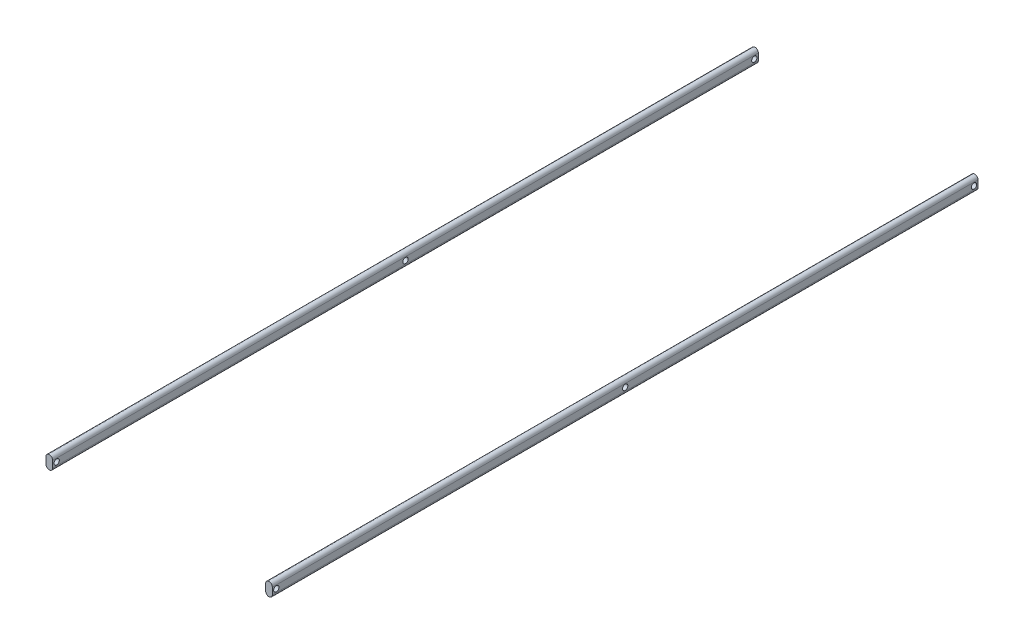
ISO-10303-21;
HEADER;
FILE_DESCRIPTION(('STEP AP214'),'2;1');
FILE_NAME('part.step','',(''),(''),'','','');
FILE_SCHEMA(('AUTOMOTIVE_DESIGN { 1 0 10303 214 1 1 1 1 }'));
ENDSEC;
DATA;
#1=APPLICATION_CONTEXT('core data for automotive mechanical design processes');
#2=APPLICATION_PROTOCOL_DEFINITION('international standard','automotive_design',2000,#1);
#3=PRODUCT_CONTEXT('',#1,'mechanical');
#4=PRODUCT('Part','Part','',(#3));
#5=PRODUCT_RELATED_PRODUCT_CATEGORY('part','',(#4));
#6=PRODUCT_DEFINITION_FORMATION('','',#4);
#7=PRODUCT_DEFINITION_CONTEXT('part definition',#1,'design');
#8=PRODUCT_DEFINITION('design','',#6,#7);
#9=PRODUCT_DEFINITION_SHAPE('','',#8);
#10=(LENGTH_UNIT() NAMED_UNIT(*) SI_UNIT(.MILLI.,.METRE.));
#11=(NAMED_UNIT(*) PLANE_ANGLE_UNIT() SI_UNIT($,.RADIAN.));
#12=(NAMED_UNIT(*) SI_UNIT($,.STERADIAN.) SOLID_ANGLE_UNIT());
#13=UNCERTAINTY_MEASURE_WITH_UNIT(LENGTH_MEASURE(1.E-05),#10,'distance_accuracy_value','');
#14=(GEOMETRIC_REPRESENTATION_CONTEXT(3) GLOBAL_UNCERTAINTY_ASSIGNED_CONTEXT((#13)) GLOBAL_UNIT_ASSIGNED_CONTEXT((#10,
#11,#12)) REPRESENTATION_CONTEXT('',''));
#15=CARTESIAN_POINT('',(0.,0.,0.));
#16=DIRECTION('',(0.,0.,1.));
#17=DIRECTION('',(1.,0.,0.));
#18=AXIS2_PLACEMENT_3D('',#15,#16,#17);
#19=CARTESIAN_POINT('',(92.2540983606557,7.70491803278685,530.));
#20=DIRECTION('',(0.,0.,-1.));
#21=DIRECTION('',(-1.,0.,0.));
#22=AXIS2_PLACEMENT_3D('',#19,#20,#21);
#23=CYLINDRICAL_SURFACE('',#22,2.5);
#24=DIRECTION('',(0.,0.,-1.));
#25=VECTOR('',#24,1.);
#26=CARTESIAN_POINT('',(94.7540983606557,7.70491803278685,100.));
#27=LINE('',#26,#25);
#28=CARTESIAN_POINT('',(94.7540983606557,7.70491803278685,530.));
#29=VERTEX_POINT('',#28);
#30=CARTESIAN_POINT('',(94.7540983606557,7.70491803278685,0.));
#31=VERTEX_POINT('',#30);
#32=EDGE_CURVE('E90',#29,#31,#27,.T.);
#33=ORIENTED_EDGE('',*,*,#32,.F.);
#34=CARTESIAN_POINT('',(92.2540983606557,7.70491803278685,530.));
#35=DIRECTION('',(0.,0.,1.));
#36=DIRECTION('',(1.,0.,0.));
#37=AXIS2_PLACEMENT_3D('',#34,#35,#36);
#38=CIRCLE('',#37,2.5);
#39=CARTESIAN_POINT('',(89.7540983606557,7.70491803278685,530.));
#40=VERTEX_POINT('',#39);
#41=EDGE_CURVE('E53',#40,#29,#38,.T.);
#42=ORIENTED_EDGE('',*,*,#41,.F.);
#43=DIRECTION('',(0.,0.,-1.));
#44=VECTOR('',#43,1.);
#45=CARTESIAN_POINT('',(89.7540983606557,7.70491803278685,100.));
#46=LINE('',#45,#44);
#47=CARTESIAN_POINT('',(89.7540983606557,7.70491803278685,0.));
#48=VERTEX_POINT('',#47);
#49=EDGE_CURVE('E117',#48,#40,#46,.F.);
#50=ORIENTED_EDGE('',*,*,#49,.F.);
#51=CARTESIAN_POINT('',(92.2540983606557,7.70491803278685,0.));
#52=DIRECTION('',(0.,0.,1.));
#53=DIRECTION('',(1.,0.,0.));
#54=AXIS2_PLACEMENT_3D('',#51,#52,#53);
#55=CIRCLE('',#54,2.5);
#56=EDGE_CURVE('E12',#31,#48,#55,.F.);
#57=ORIENTED_EDGE('',*,*,#56,.F.);
#58=EDGE_LOOP('',(#33,#42,#50,#57));
#59=FACE_BOUND('',#58,.T.);
#60=ADVANCED_FACE('F45',(#59),#23,.T.);
#61=CARTESIAN_POINT('',(92.2540983606557,12.7049180327869,0.));
#62=DIRECTION('',(0.,0.,-1.));
#63=DIRECTION('',(-1.,0.,0.));
#64=AXIS2_PLACEMENT_3D('',#61,#62,#63);
#65=CYLINDRICAL_SURFACE('',#64,2.5);
#66=DIRECTION('',(0.,0.,-1.));
#67=VECTOR('',#66,1.);
#68=CARTESIAN_POINT('',(94.7540983606557,12.7049180327869,100.));
#69=LINE('',#68,#67);
#70=CARTESIAN_POINT('',(94.7540983606557,12.7049180327869,0.));
#71=VERTEX_POINT('',#70);
#72=CARTESIAN_POINT('',(94.7540983606557,12.7049180327869,530.));
#73=VERTEX_POINT('',#72);
#74=EDGE_CURVE('E89',#71,#73,#69,.F.);
#75=ORIENTED_EDGE('',*,*,#74,.F.);
#76=CARTESIAN_POINT('',(92.2540983606557,12.7049180327869,0.));
#77=DIRECTION('',(0.,0.,1.));
#78=DIRECTION('',(1.,0.,0.));
#79=AXIS2_PLACEMENT_3D('',#76,#77,#78);
#80=CIRCLE('',#79,2.5);
#81=CARTESIAN_POINT('',(89.7540983606557,12.7049180327869,0.));
#82=VERTEX_POINT('',#81);
#83=EDGE_CURVE('E95',#82,#71,#80,.F.);
#84=ORIENTED_EDGE('',*,*,#83,.F.);
#85=DIRECTION('',(0.,0.,-1.));
#86=VECTOR('',#85,1.);
#87=CARTESIAN_POINT('',(89.7540983606557,12.7049180327869,100.));
#88=LINE('',#87,#86);
#89=CARTESIAN_POINT('',(89.7540983606557,12.7049180327869,530.));
#90=VERTEX_POINT('',#89);
#91=EDGE_CURVE('E103',#90,#82,#88,.T.);
#92=ORIENTED_EDGE('',*,*,#91,.F.);
#93=CARTESIAN_POINT('',(92.2540983606557,12.7049180327869,530.));
#94=DIRECTION('',(0.,0.,1.));
#95=DIRECTION('',(1.,0.,0.));
#96=AXIS2_PLACEMENT_3D('',#93,#94,#95);
#97=CIRCLE('',#96,2.5);
#98=EDGE_CURVE('E102',#73,#90,#97,.T.);
#99=ORIENTED_EDGE('',*,*,#98,.F.);
#100=EDGE_LOOP('',(#75,#84,#92,#99));
#101=FACE_BOUND('',#100,.T.);
#102=ADVANCED_FACE('F106',(#101),#65,.T.);
#103=CARTESIAN_POINT('',(0.,0.,0.));
#104=DIRECTION('',(0.,0.,1.));
#105=DIRECTION('',(1.,0.,0.));
#106=AXIS2_PLACEMENT_3D('',#103,#104,#105);
#107=PLANE('',#106);
#108=DIRECTION('',(0.,1.,0.));
#109=VECTOR('',#108,1.);
#110=CARTESIAN_POINT('',(94.7540983606557,5.20491803278685,0.));
#111=LINE('',#110,#109);
#112=EDGE_CURVE('E83',#31,#71,#111,.T.);
#113=ORIENTED_EDGE('',*,*,#112,.F.);
#114=ORIENTED_EDGE('',*,*,#56,.T.);
#115=DIRECTION('',(0.,1.,0.));
#116=VECTOR('',#115,1.);
#117=CARTESIAN_POINT('',(89.7540983606557,0.204918032786853,0.));
#118=LINE('',#117,#116);
#119=EDGE_CURVE('E98',#48,#82,#118,.T.);
#120=ORIENTED_EDGE('',*,*,#119,.T.);
#121=ORIENTED_EDGE('',*,*,#83,.T.);
#122=EDGE_LOOP('',(#113,#114,#120,#121));
#123=FACE_BOUND('',#122,.T.);
#124=ADVANCED_FACE('F96',(#123),#107,.F.);
#125=CARTESIAN_POINT('',(94.7540983606557,10.2049180327869,3.));
#126=DIRECTION('',(1.,0.,0.));
#127=DIRECTION('',(0.,0.,-1.));
#128=AXIS2_PLACEMENT_3D('',#125,#126,#127);
#129=CYLINDRICAL_SURFACE('',#128,1.99999999999997);
#130=CARTESIAN_POINT('',(94.7540983606557,10.2049180327869,3.));
#131=DIRECTION('',(1.,0.,0.));
#132=DIRECTION('',(0.,0.,-1.));
#133=AXIS2_PLACEMENT_3D('',#130,#131,#132);
#134=CIRCLE('',#133,1.99999999999998);
#135=CARTESIAN_POINT('',(94.7540983606557,10.2049180327869,1.00000000000002));
#136=VERTEX_POINT('',#135);
#137=EDGE_CURVE('E130',#136,#136,#134,.T.);
#138=ORIENTED_EDGE('',*,*,#137,.T.);
#139=EDGE_LOOP('',(#138));
#140=FACE_BOUND('',#139,.T.);
#141=CARTESIAN_POINT('',(89.7540983606557,10.2049180327869,3.));
#142=DIRECTION('',(1.,0.,0.));
#143=DIRECTION('',(0.,1.,0.));
#144=AXIS2_PLACEMENT_3D('',#141,#142,#143);
#145=CIRCLE('',#144,1.99999999999997);
#146=CARTESIAN_POINT('',(89.7540983606557,12.2049180327868,3.));
#147=VERTEX_POINT('',#146);
#148=EDGE_CURVE('E92',#147,#147,#145,.F.);
#149=ORIENTED_EDGE('',*,*,#148,.T.);
#150=EDGE_LOOP('',(#149));
#151=FACE_BOUND('',#150,.T.);
#152=ADVANCED_FACE('F140',(#140,#151),#129,.F.);
#153=CARTESIAN_POINT('',(94.7540983606557,5.20491803278685,100.));
#154=DIRECTION('',(-1.,0.,0.));
#155=DIRECTION('',(0.,0.,1.));
#156=AXIS2_PLACEMENT_3D('',#153,#154,#155);
#157=PLANE('',#156);
#158=CARTESIAN_POINT('',(94.7540983606557,10.2049180327869,527.));
#159=DIRECTION('',(1.,0.,0.));
#160=DIRECTION('',(0.,0.,-1.));
#161=AXIS2_PLACEMENT_3D('',#158,#159,#160);
#162=CIRCLE('',#161,1.99999999999998);
#163=CARTESIAN_POINT('',(94.7540983606557,10.2049180327869,525.));
#164=VERTEX_POINT('',#163);
#165=EDGE_CURVE('E107',#164,#164,#162,.T.);
#166=ORIENTED_EDGE('',*,*,#165,.F.);
#167=EDGE_LOOP('',(#166));
#168=FACE_BOUND('',#167,.T.);
#169=ORIENTED_EDGE('',*,*,#137,.F.);
#170=EDGE_LOOP('',(#169));
#171=FACE_BOUND('',#170,.T.);
#172=DIRECTION('',(0.,1.,0.));
#173=VECTOR('',#172,1.);
#174=CARTESIAN_POINT('',(94.7540983606557,5.20491803278685,530.));
#175=LINE('',#174,#173);
#176=EDGE_CURVE('E121',#29,#73,#175,.T.);
#177=ORIENTED_EDGE('',*,*,#176,.F.);
#178=ORIENTED_EDGE('',*,*,#32,.T.);
#179=ORIENTED_EDGE('',*,*,#112,.T.);
#180=ORIENTED_EDGE('',*,*,#74,.T.);
#181=EDGE_LOOP('',(#177,#178,#179,#180));
#182=FACE_BOUND('',#181,.T.);
#183=CARTESIAN_POINT('',(94.7540983606557,10.2049180327867,265.));
#184=DIRECTION('',(1.,0.,0.));
#185=DIRECTION('',(0.,0.,-1.));
#186=AXIS2_PLACEMENT_3D('',#183,#184,#185);
#187=CIRCLE('',#186,1.99999999999998);
#188=CARTESIAN_POINT('',(94.7540983606557,10.2049180327867,263.));
#189=VERTEX_POINT('',#188);
#190=EDGE_CURVE('E111',#189,#189,#187,.T.);
#191=ORIENTED_EDGE('',*,*,#190,.F.);
#192=EDGE_LOOP('',(#191));
#193=FACE_BOUND('',#192,.T.);
#194=ADVANCED_FACE('F86',(#168,#171,#182,#193),#157,.F.);
#195=CARTESIAN_POINT('',(89.7540983606557,15.2049180327869,100.));
#196=DIRECTION('',(1.,0.,0.));
#197=DIRECTION('',(0.,0.,-1.));
#198=AXIS2_PLACEMENT_3D('',#195,#196,#197);
#199=PLANE('',#198);
#200=ORIENTED_EDGE('',*,*,#119,.F.);
#201=ORIENTED_EDGE('',*,*,#49,.T.);
#202=DIRECTION('',(0.,-1.,0.));
#203=VECTOR('',#202,1.);
#204=CARTESIAN_POINT('',(89.7540983606557,15.2049180327869,530.));
#205=LINE('',#204,#203);
#206=EDGE_CURVE('E123',#90,#40,#205,.T.);
#207=ORIENTED_EDGE('',*,*,#206,.F.);
#208=ORIENTED_EDGE('',*,*,#91,.T.);
#209=EDGE_LOOP('',(#200,#201,#207,#208));
#210=FACE_BOUND('',#209,.T.);
#211=CARTESIAN_POINT('',(89.7540983606557,10.2049180327869,527.));
#212=DIRECTION('',(1.,0.,0.));
#213=DIRECTION('',(0.,0.,-1.));
#214=AXIS2_PLACEMENT_3D('',#211,#212,#213);
#215=CIRCLE('',#214,1.99999999999997);
#216=CARTESIAN_POINT('',(89.7540983606557,10.2049180327869,525.));
#217=VERTEX_POINT('',#216);
#218=EDGE_CURVE('E91',#217,#217,#215,.T.);
#219=ORIENTED_EDGE('',*,*,#218,.T.);
#220=EDGE_LOOP('',(#219));
#221=FACE_BOUND('',#220,.T.);
#222=CARTESIAN_POINT('',(89.7540983606557,10.2049180327867,265.));
#223=DIRECTION('',(1.,0.,0.));
#224=DIRECTION('',(0.,0.,-1.));
#225=AXIS2_PLACEMENT_3D('',#222,#223,#224);
#226=CIRCLE('',#225,1.99999999999997);
#227=CARTESIAN_POINT('',(89.7540983606557,10.2049180327867,263.));
#228=VERTEX_POINT('',#227);
#229=EDGE_CURVE('E124',#228,#228,#226,.T.);
#230=ORIENTED_EDGE('',*,*,#229,.T.);
#231=EDGE_LOOP('',(#230));
#232=FACE_BOUND('',#231,.T.);
#233=ORIENTED_EDGE('',*,*,#148,.F.);
#234=EDGE_LOOP('',(#233));
#235=FACE_BOUND('',#234,.T.);
#236=ADVANCED_FACE('F139',(#210,#221,#232,#235),#199,.F.);
#237=CARTESIAN_POINT('',(0.,0.,530.));
#238=DIRECTION('',(0.,0.,1.));
#239=DIRECTION('',(1.,0.,0.));
#240=AXIS2_PLACEMENT_3D('',#237,#238,#239);
#241=PLANE('',#240);
#242=ORIENTED_EDGE('',*,*,#206,.T.);
#243=ORIENTED_EDGE('',*,*,#41,.T.);
#244=ORIENTED_EDGE('',*,*,#176,.T.);
#245=ORIENTED_EDGE('',*,*,#98,.T.);
#246=EDGE_LOOP('',(#242,#243,#244,#245));
#247=FACE_BOUND('',#246,.T.);
#248=ADVANCED_FACE('F120',(#247),#241,.T.);
#249=CARTESIAN_POINT('',(94.7540983606557,10.2049180327867,265.));
#250=DIRECTION('',(1.,0.,0.));
#251=DIRECTION('',(0.,0.,-1.));
#252=AXIS2_PLACEMENT_3D('',#249,#250,#251);
#253=CYLINDRICAL_SURFACE('',#252,1.99999999999997);
#254=ORIENTED_EDGE('',*,*,#190,.T.);
#255=EDGE_LOOP('',(#254));
#256=FACE_BOUND('',#255,.T.);
#257=ORIENTED_EDGE('',*,*,#229,.F.);
#258=EDGE_LOOP('',(#257));
#259=FACE_BOUND('',#258,.T.);
#260=ADVANCED_FACE('F136',(#256,#259),#253,.F.);
#261=CARTESIAN_POINT('',(94.7540983606557,10.2049180327869,527.));
#262=DIRECTION('',(1.,0.,0.));
#263=DIRECTION('',(0.,0.,-1.));
#264=AXIS2_PLACEMENT_3D('',#261,#262,#263);
#265=CYLINDRICAL_SURFACE('',#264,1.99999999999997);
#266=ORIENTED_EDGE('',*,*,#165,.T.);
#267=EDGE_LOOP('',(#266));
#268=FACE_BOUND('',#267,.T.);
#269=ORIENTED_EDGE('',*,*,#218,.F.);
#270=EDGE_LOOP('',(#269));
#271=FACE_BOUND('',#270,.T.);
#272=ADVANCED_FACE('F165',(#268,#271),#265,.F.);
#273=CLOSED_SHELL('',(#60,#102,#124,#152,#194,#236,#248,#260,#272));
#274=MANIFOLD_SOLID_BREP('B2',#273);
#275=CARTESIAN_POINT('',(-72.7459016393443,7.70491803278685,530.));
#276=DIRECTION('',(0.,0.,-1.));
#277=DIRECTION('',(-1.,0.,0.));
#278=AXIS2_PLACEMENT_3D('',#275,#276,#277);
#279=CYLINDRICAL_SURFACE('',#278,2.5);
#280=DIRECTION('',(0.,0.,-1.));
#281=VECTOR('',#280,1.);
#282=CARTESIAN_POINT('',(-70.2459016393443,7.70491803278685,100.));
#283=LINE('',#282,#281);
#284=CARTESIAN_POINT('',(-70.2459016393443,7.70491803278685,530.));
#285=VERTEX_POINT('',#284);
#286=CARTESIAN_POINT('',(-70.2459016393443,7.70491803278685,0.));
#287=VERTEX_POINT('',#286);
#288=EDGE_CURVE('E307',#285,#287,#283,.T.);
#289=ORIENTED_EDGE('',*,*,#288,.F.);
#290=CARTESIAN_POINT('',(-72.7459016393443,7.70491803278685,530.));
#291=DIRECTION('',(0.,0.,1.));
#292=DIRECTION('',(1.,0.,0.));
#293=AXIS2_PLACEMENT_3D('',#290,#291,#292);
#294=CIRCLE('',#293,2.5);
#295=CARTESIAN_POINT('',(-75.2459016393443,7.70491803278685,530.));
#296=VERTEX_POINT('',#295);
#297=EDGE_CURVE('E267',#296,#285,#294,.T.);
#298=ORIENTED_EDGE('',*,*,#297,.F.);
#299=DIRECTION('',(0.,0.,-1.));
#300=VECTOR('',#299,1.);
#301=CARTESIAN_POINT('',(-75.2459016393443,7.70491803278685,100.));
#302=LINE('',#301,#300);
#303=CARTESIAN_POINT('',(-75.2459016393443,7.70491803278685,0.));
#304=VERTEX_POINT('',#303);
#305=EDGE_CURVE('E337',#304,#296,#302,.F.);
#306=ORIENTED_EDGE('',*,*,#305,.F.);
#307=CARTESIAN_POINT('',(-72.7459016393443,7.70491803278685,0.));
#308=DIRECTION('',(0.,0.,1.));
#309=DIRECTION('',(1.,0.,0.));
#310=AXIS2_PLACEMENT_3D('',#307,#308,#309);
#311=CIRCLE('',#310,2.5);
#312=EDGE_CURVE('E43',#287,#304,#311,.F.);
#313=ORIENTED_EDGE('',*,*,#312,.F.);
#314=EDGE_LOOP('',(#289,#298,#306,#313));
#315=FACE_BOUND('',#314,.T.);
#316=ADVANCED_FACE('F259',(#315),#279,.T.);
#317=CARTESIAN_POINT('',(-72.7459016393443,12.7049180327868,530.));
#318=DIRECTION('',(0.,0.,-1.));
#319=DIRECTION('',(-1.,0.,0.));
#320=AXIS2_PLACEMENT_3D('',#317,#318,#319);
#321=CYLINDRICAL_SURFACE('',#320,2.5);
#322=DIRECTION('',(0.,0.,-1.));
#323=VECTOR('',#322,1.);
#324=CARTESIAN_POINT('',(-75.2459016393443,12.7049180327868,100.));
#325=LINE('',#324,#323);
#326=CARTESIAN_POINT('',(-75.2459016393443,12.7049180327868,530.));
#327=VERTEX_POINT('',#326);
#328=CARTESIAN_POINT('',(-75.2459016393443,12.7049180327868,0.));
#329=VERTEX_POINT('',#328);
#330=EDGE_CURVE('E303',#327,#329,#325,.T.);
#331=ORIENTED_EDGE('',*,*,#330,.F.);
#332=CARTESIAN_POINT('',(-72.7459016393443,12.7049180327868,530.));
#333=DIRECTION('',(0.,0.,1.));
#334=DIRECTION('',(1.,0.,0.));
#335=AXIS2_PLACEMENT_3D('',#332,#333,#334);
#336=CIRCLE('',#335,2.5);
#337=CARTESIAN_POINT('',(-70.2459016393443,12.7049180327868,530.));
#338=VERTEX_POINT('',#337);
#339=EDGE_CURVE('E308',#338,#327,#336,.T.);
#340=ORIENTED_EDGE('',*,*,#339,.F.);
#341=DIRECTION('',(0.,0.,-1.));
#342=VECTOR('',#341,1.);
#343=CARTESIAN_POINT('',(-70.2459016393443,12.7049180327868,100.));
#344=LINE('',#343,#342);
#345=CARTESIAN_POINT('',(-70.2459016393443,12.7049180327868,0.));
#346=VERTEX_POINT('',#345);
#347=EDGE_CURVE('E306',#346,#338,#344,.F.);
#348=ORIENTED_EDGE('',*,*,#347,.F.);
#349=CARTESIAN_POINT('',(-72.7459016393443,12.7049180327868,0.));
#350=DIRECTION('',(0.,0.,1.));
#351=DIRECTION('',(1.,0.,0.));
#352=AXIS2_PLACEMENT_3D('',#349,#350,#351);
#353=CIRCLE('',#352,2.5);
#354=EDGE_CURVE('E299',#329,#346,#353,.F.);
#355=ORIENTED_EDGE('',*,*,#354,.F.);
#356=EDGE_LOOP('',(#331,#340,#348,#355));
#357=FACE_BOUND('',#356,.T.);
#358=ADVANCED_FACE('F301',(#357),#321,.T.);
#359=CARTESIAN_POINT('',(0.,0.,530.));
#360=DIRECTION('',(0.,0.,1.));
#361=DIRECTION('',(1.,0.,0.));
#362=AXIS2_PLACEMENT_3D('',#359,#360,#361);
#363=PLANE('',#362);
#364=DIRECTION('',(0.,-1.,0.));
#365=VECTOR('',#364,1.);
#366=CARTESIAN_POINT('',(-75.2459016393443,15.2049180327868,530.));
#367=LINE('',#366,#365);
#368=EDGE_CURVE('E315',#327,#296,#367,.T.);
#369=ORIENTED_EDGE('',*,*,#368,.T.);
#370=ORIENTED_EDGE('',*,*,#297,.T.);
#371=DIRECTION('',(0.,1.,0.));
#372=VECTOR('',#371,1.);
#373=CARTESIAN_POINT('',(-70.2459016393443,10.2049180327868,530.));
#374=LINE('',#373,#372);
#375=EDGE_CURVE('E322',#285,#338,#374,.T.);
#376=ORIENTED_EDGE('',*,*,#375,.T.);
#377=ORIENTED_EDGE('',*,*,#339,.T.);
#378=EDGE_LOOP('',(#369,#370,#376,#377));
#379=FACE_BOUND('',#378,.T.);
#380=ADVANCED_FACE('F339',(#379),#363,.T.);
#381=CARTESIAN_POINT('',(94.7540983606557,10.2049180327867,265.));
#382=DIRECTION('',(1.,0.,0.));
#383=DIRECTION('',(0.,0.,-1.));
#384=AXIS2_PLACEMENT_3D('',#381,#382,#383);
#385=CYLINDRICAL_SURFACE('',#384,1.99999999999997);
#386=CARTESIAN_POINT('',(-75.2459016393443,10.2049180327867,265.));
#387=DIRECTION('',(1.,0.,0.));
#388=DIRECTION('',(0.,0.,-1.));
#389=AXIS2_PLACEMENT_3D('',#386,#387,#388);
#390=CIRCLE('',#389,1.99999999999996);
#391=CARTESIAN_POINT('',(-75.2459016393443,10.2049180327867,263.));
#392=VERTEX_POINT('',#391);
#393=EDGE_CURVE('E331',#392,#392,#390,.T.);
#394=ORIENTED_EDGE('',*,*,#393,.F.);
#395=EDGE_LOOP('',(#394));
#396=FACE_BOUND('',#395,.T.);
#397=CARTESIAN_POINT('',(-70.2459016393443,10.2049180327867,265.));
#398=DIRECTION('',(-1.,0.,0.));
#399=DIRECTION('',(0.,0.,1.));
#400=AXIS2_PLACEMENT_3D('',#397,#398,#399);
#401=CIRCLE('',#400,1.99999999999997);
#402=CARTESIAN_POINT('',(-70.2459016393443,10.2049180327867,267.));
#403=VERTEX_POINT('',#402);
#404=EDGE_CURVE('E328',#403,#403,#401,.T.);
#405=ORIENTED_EDGE('',*,*,#404,.F.);
#406=EDGE_LOOP('',(#405));
#407=FACE_BOUND('',#406,.T.);
#408=ADVANCED_FACE('F361',(#396,#407),#385,.F.);
#409=CARTESIAN_POINT('',(94.7540983606557,10.2049180327869,527.));
#410=DIRECTION('',(1.,0.,0.));
#411=DIRECTION('',(0.,0.,-1.));
#412=AXIS2_PLACEMENT_3D('',#409,#410,#411);
#413=CYLINDRICAL_SURFACE('',#412,1.99999999999997);
#414=CARTESIAN_POINT('',(-75.2459016393443,10.2049180327869,527.));
#415=DIRECTION('',(1.,0.,0.));
#416=DIRECTION('',(0.,0.,-1.));
#417=AXIS2_PLACEMENT_3D('',#414,#415,#416);
#418=CIRCLE('',#417,1.99999999999996);
#419=CARTESIAN_POINT('',(-75.2459016393443,10.2049180327869,525.));
#420=VERTEX_POINT('',#419);
#421=EDGE_CURVE('E352',#420,#420,#418,.T.);
#422=ORIENTED_EDGE('',*,*,#421,.F.);
#423=EDGE_LOOP('',(#422));
#424=FACE_BOUND('',#423,.T.);
#425=CARTESIAN_POINT('',(-70.2459016393443,10.2049180327869,527.));
#426=DIRECTION('',(-1.,0.,0.));
#427=DIRECTION('',(0.,0.,1.));
#428=AXIS2_PLACEMENT_3D('',#425,#426,#427);
#429=CIRCLE('',#428,1.99999999999997);
#430=CARTESIAN_POINT('',(-70.2459016393443,10.2049180327869,529.));
#431=VERTEX_POINT('',#430);
#432=EDGE_CURVE('E349',#431,#431,#429,.T.);
#433=ORIENTED_EDGE('',*,*,#432,.F.);
#434=EDGE_LOOP('',(#433));
#435=FACE_BOUND('',#434,.T.);
#436=ADVANCED_FACE('F358',(#424,#435),#413,.F.);
#437=CARTESIAN_POINT('',(-75.2459016393443,15.2049180327868,100.));
#438=DIRECTION('',(1.,0.,0.));
#439=DIRECTION('',(0.,0.,-1.));
#440=AXIS2_PLACEMENT_3D('',#437,#438,#439);
#441=PLANE('',#440);
#442=ORIENTED_EDGE('',*,*,#421,.T.);
#443=EDGE_LOOP('',(#442));
#444=FACE_BOUND('',#443,.T.);
#445=ORIENTED_EDGE('',*,*,#393,.T.);
#446=EDGE_LOOP('',(#445));
#447=FACE_BOUND('',#446,.T.);
#448=CARTESIAN_POINT('',(-75.2459016393443,10.2049180327869,3.));
#449=DIRECTION('',(1.,0.,0.));
#450=DIRECTION('',(0.,0.,-1.));
#451=AXIS2_PLACEMENT_3D('',#448,#449,#450);
#452=CIRCLE('',#451,1.99999999999996);
#453=CARTESIAN_POINT('',(-75.2459016393443,10.2049180327869,1.00000000000004));
#454=VERTEX_POINT('',#453);
#455=EDGE_CURVE('E330',#454,#454,#452,.T.);
#456=ORIENTED_EDGE('',*,*,#455,.T.);
#457=EDGE_LOOP('',(#456));
#458=FACE_BOUND('',#457,.T.);
#459=DIRECTION('',(0.,-1.,0.));
#460=VECTOR('',#459,1.);
#461=CARTESIAN_POINT('',(-75.2459016393443,15.2049180327868,0.));
#462=LINE('',#461,#460);
#463=EDGE_CURVE('E313',#329,#304,#462,.T.);
#464=ORIENTED_EDGE('',*,*,#463,.T.);
#465=ORIENTED_EDGE('',*,*,#305,.T.);
#466=ORIENTED_EDGE('',*,*,#368,.F.);
#467=ORIENTED_EDGE('',*,*,#330,.T.);
#468=EDGE_LOOP('',(#464,#465,#466,#467));
#469=FACE_BOUND('',#468,.T.);
#470=ADVANCED_FACE('F312',(#444,#447,#458,#469),#441,.F.);
#471=CARTESIAN_POINT('',(0.,0.,0.));
#472=DIRECTION('',(0.,0.,1.));
#473=DIRECTION('',(1.,0.,0.));
#474=AXIS2_PLACEMENT_3D('',#471,#472,#473);
#475=PLANE('',#474);
#476=DIRECTION('',(0.,1.,0.));
#477=VECTOR('',#476,1.);
#478=CARTESIAN_POINT('',(-70.2459016393443,10.2049180327868,0.));
#479=LINE('',#478,#477);
#480=EDGE_CURVE('E319',#287,#346,#479,.T.);
#481=ORIENTED_EDGE('',*,*,#480,.F.);
#482=ORIENTED_EDGE('',*,*,#312,.T.);
#483=ORIENTED_EDGE('',*,*,#463,.F.);
#484=ORIENTED_EDGE('',*,*,#354,.T.);
#485=EDGE_LOOP('',(#481,#482,#483,#484));
#486=FACE_BOUND('',#485,.T.);
#487=ADVANCED_FACE('F318',(#486),#475,.F.);
#488=CARTESIAN_POINT('',(94.7540983606557,10.2049180327869,3.));
#489=DIRECTION('',(1.,0.,0.));
#490=DIRECTION('',(0.,0.,-1.));
#491=AXIS2_PLACEMENT_3D('',#488,#489,#490);
#492=CYLINDRICAL_SURFACE('',#491,1.99999999999997);
#493=ORIENTED_EDGE('',*,*,#455,.F.);
#494=EDGE_LOOP('',(#493));
#495=FACE_BOUND('',#494,.T.);
#496=CARTESIAN_POINT('',(-70.2459016393443,10.2049180327869,3.));
#497=DIRECTION('',(-1.,0.,0.));
#498=DIRECTION('',(0.,0.,1.));
#499=AXIS2_PLACEMENT_3D('',#496,#497,#498);
#500=CIRCLE('',#499,1.99999999999997);
#501=CARTESIAN_POINT('',(-70.2459016393443,10.2049180327869,4.99999999999997));
#502=VERTEX_POINT('',#501);
#503=EDGE_CURVE('E316',#502,#502,#500,.T.);
#504=ORIENTED_EDGE('',*,*,#503,.F.);
#505=EDGE_LOOP('',(#504));
#506=FACE_BOUND('',#505,.T.);
#507=ADVANCED_FACE('F366',(#495,#506),#492,.F.);
#508=CARTESIAN_POINT('',(-70.2459016393443,10.2049180327868,100.));
#509=DIRECTION('',(-1.,0.,0.));
#510=DIRECTION('',(0.,0.,1.));
#511=AXIS2_PLACEMENT_3D('',#508,#509,#510);
#512=PLANE('',#511);
#513=ORIENTED_EDGE('',*,*,#375,.F.);
#514=ORIENTED_EDGE('',*,*,#288,.T.);
#515=ORIENTED_EDGE('',*,*,#480,.T.);
#516=ORIENTED_EDGE('',*,*,#347,.T.);
#517=EDGE_LOOP('',(#513,#514,#515,#516));
#518=FACE_BOUND('',#517,.T.);
#519=ORIENTED_EDGE('',*,*,#432,.T.);
#520=EDGE_LOOP('',(#519));
#521=FACE_BOUND('',#520,.T.);
#522=ORIENTED_EDGE('',*,*,#404,.T.);
#523=EDGE_LOOP('',(#522));
#524=FACE_BOUND('',#523,.T.);
#525=ORIENTED_EDGE('',*,*,#503,.T.);
#526=EDGE_LOOP('',(#525));
#527=FACE_BOUND('',#526,.T.);
#528=ADVANCED_FACE('F342',(#518,#521,#524,#527),#512,.F.);
#529=CLOSED_SHELL('',(#316,#358,#380,#408,#436,#470,#487,#507,#528));
#530=MANIFOLD_SOLID_BREP('B6',#529);
#531=ADVANCED_BREP_SHAPE_REPRESENTATION('',(#18,#274,#530),#14);
#532=SHAPE_DEFINITION_REPRESENTATION(#9,#531);
ENDSEC;
END-ISO-10303-21;
